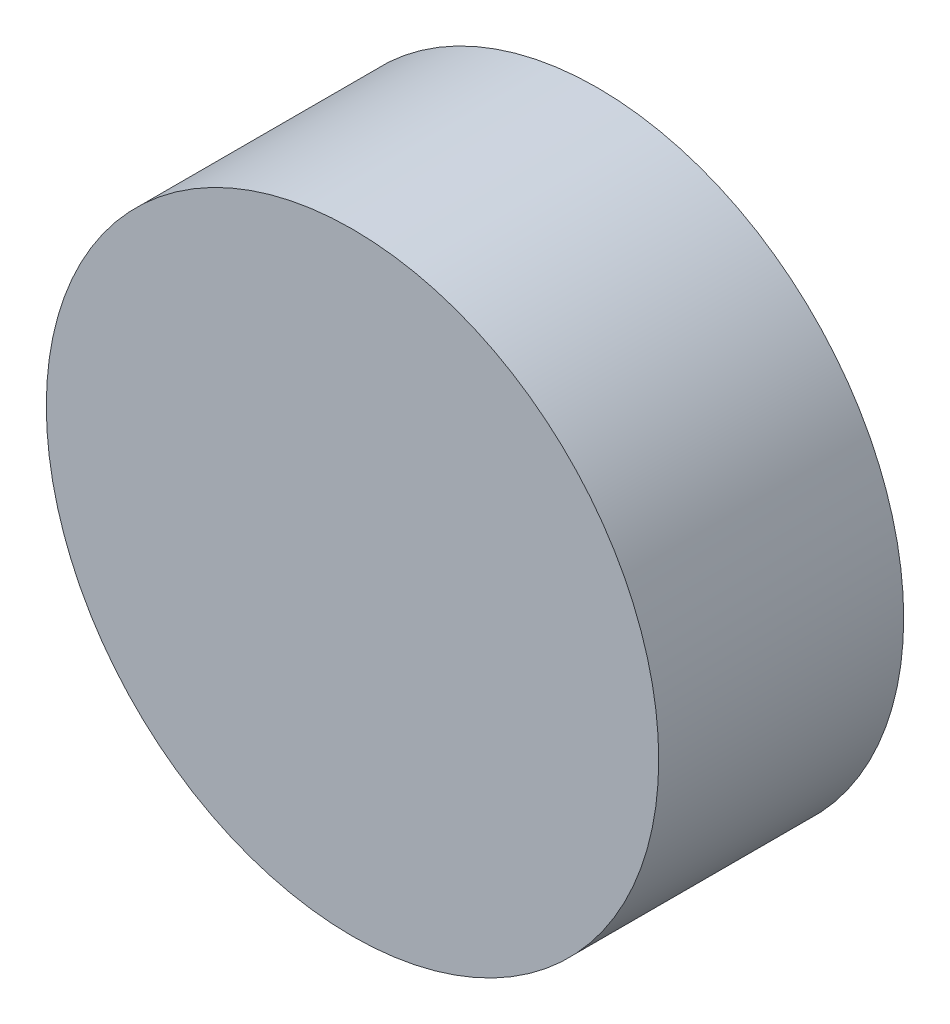
ISO-10303-21;
HEADER;
FILE_DESCRIPTION(('STEP AP214'),'2;1');
FILE_NAME('part.step','',(''),(''),'','','');
FILE_SCHEMA(('AUTOMOTIVE_DESIGN { 1 0 10303 214 1 1 1 1 }'));
ENDSEC;
DATA;
#1=APPLICATION_CONTEXT('core data for automotive mechanical design processes');
#2=APPLICATION_PROTOCOL_DEFINITION('international standard','automotive_design',2000,#1);
#3=PRODUCT_CONTEXT('',#1,'mechanical');
#4=PRODUCT('Part','Part','',(#3));
#5=PRODUCT_RELATED_PRODUCT_CATEGORY('part','',(#4));
#6=PRODUCT_DEFINITION_FORMATION('','',#4);
#7=PRODUCT_DEFINITION_CONTEXT('part definition',#1,'design');
#8=PRODUCT_DEFINITION('design','',#6,#7);
#9=PRODUCT_DEFINITION_SHAPE('','',#8);
#10=(LENGTH_UNIT() NAMED_UNIT(*) SI_UNIT(.MILLI.,.METRE.));
#11=(NAMED_UNIT(*) PLANE_ANGLE_UNIT() SI_UNIT($,.RADIAN.));
#12=(NAMED_UNIT(*) SI_UNIT($,.STERADIAN.) SOLID_ANGLE_UNIT());
#13=UNCERTAINTY_MEASURE_WITH_UNIT(LENGTH_MEASURE(1.E-05),#10,'distance_accuracy_value','');
#14=(GEOMETRIC_REPRESENTATION_CONTEXT(3) GLOBAL_UNCERTAINTY_ASSIGNED_CONTEXT((#13)) GLOBAL_UNIT_ASSIGNED_CONTEXT((#10,
#11,#12)) REPRESENTATION_CONTEXT('',''));
#15=CARTESIAN_POINT('',(0.,0.,0.));
#16=DIRECTION('',(0.,0.,1.));
#17=DIRECTION('',(1.,0.,0.));
#18=AXIS2_PLACEMENT_3D('',#15,#16,#17);
#19=CARTESIAN_POINT('',(0.,0.,16.));
#20=DIRECTION('',(0.,0.,-1.));
#21=DIRECTION('',(-1.,0.,0.));
#22=AXIS2_PLACEMENT_3D('',#19,#20,#21);
#23=CYLINDRICAL_SURFACE('',#22,20.);
#24=CARTESIAN_POINT('',(0.,0.,16.));
#25=DIRECTION('',(0.,0.,1.));
#26=DIRECTION('',(1.,0.,0.));
#27=AXIS2_PLACEMENT_3D('',#24,#25,#26);
#28=CIRCLE('',#27,20.);
#29=CARTESIAN_POINT('',(20.,0.,16.));
#30=VERTEX_POINT('',#29);
#31=EDGE_CURVE('E10',#30,#30,#28,.T.);
#32=ORIENTED_EDGE('',*,*,#31,.F.);
#33=EDGE_LOOP('',(#32));
#34=FACE_BOUND('',#33,.T.);
#35=CARTESIAN_POINT('',(0.,0.,0.));
#36=DIRECTION('',(0.,0.,1.));
#37=DIRECTION('',(1.,0.,0.));
#38=AXIS2_PLACEMENT_3D('',#35,#36,#37);
#39=CIRCLE('',#38,20.);
#40=CARTESIAN_POINT('',(20.,0.,0.));
#41=VERTEX_POINT('',#40);
#42=EDGE_CURVE('E46',#41,#41,#39,.T.);
#43=ORIENTED_EDGE('',*,*,#42,.T.);
#44=EDGE_LOOP('',(#43));
#45=FACE_BOUND('',#44,.T.);
#46=ADVANCED_FACE('F43',(#34,#45),#23,.T.);
#47=CARTESIAN_POINT('',(0.,0.,16.));
#48=DIRECTION('',(0.,0.,1.));
#49=DIRECTION('',(1.,0.,0.));
#50=AXIS2_PLACEMENT_3D('',#47,#48,#49);
#51=PLANE('',#50);
#52=ORIENTED_EDGE('',*,*,#31,.T.);
#53=EDGE_LOOP('',(#52));
#54=FACE_BOUND('',#53,.T.);
#55=ADVANCED_FACE('F60',(#54),#51,.T.);
#56=CARTESIAN_POINT('',(0.,0.,0.));
#57=DIRECTION('',(0.,0.,1.));
#58=DIRECTION('',(1.,0.,0.));
#59=AXIS2_PLACEMENT_3D('',#56,#57,#58);
#60=PLANE('',#59);
#61=ORIENTED_EDGE('',*,*,#42,.F.);
#62=EDGE_LOOP('',(#61));
#63=FACE_BOUND('',#62,.T.);
#64=ADVANCED_FACE('F58',(#63),#60,.F.);
#65=CLOSED_SHELL('',(#46,#55,#64));
#66=MANIFOLD_SOLID_BREP('B2',#65);
#67=ADVANCED_BREP_SHAPE_REPRESENTATION('',(#18,#66),#14);
#68=SHAPE_DEFINITION_REPRESENTATION(#9,#67);
ENDSEC;
END-ISO-10303-21;
